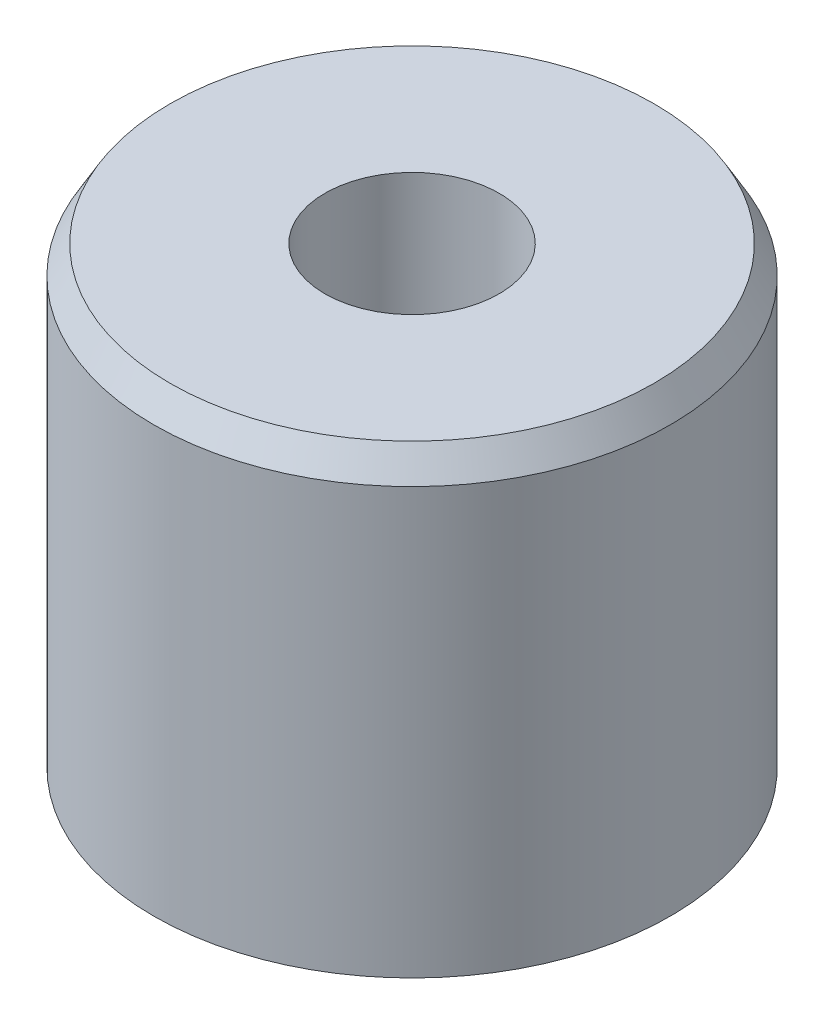
ISO-10303-21;
HEADER;
FILE_DESCRIPTION(('STEP AP214'),'2;1');
FILE_NAME('part.step','',(''),(''),'','','');
FILE_SCHEMA(('AUTOMOTIVE_DESIGN { 1 0 10303 214 1 1 1 1 }'));
ENDSEC;
DATA;
#1=APPLICATION_CONTEXT('core data for automotive mechanical design processes');
#2=APPLICATION_PROTOCOL_DEFINITION('international standard','automotive_design',2000,#1);
#3=PRODUCT_CONTEXT('',#1,'mechanical');
#4=PRODUCT('Part','Part','',(#3));
#5=PRODUCT_RELATED_PRODUCT_CATEGORY('part','',(#4));
#6=PRODUCT_DEFINITION_FORMATION('','',#4);
#7=PRODUCT_DEFINITION_CONTEXT('part definition',#1,'design');
#8=PRODUCT_DEFINITION('design','',#6,#7);
#9=PRODUCT_DEFINITION_SHAPE('','',#8);
#10=(LENGTH_UNIT() NAMED_UNIT(*) SI_UNIT(.MILLI.,.METRE.));
#11=(NAMED_UNIT(*) PLANE_ANGLE_UNIT() SI_UNIT($,.RADIAN.));
#12=(NAMED_UNIT(*) SI_UNIT($,.STERADIAN.) SOLID_ANGLE_UNIT());
#13=UNCERTAINTY_MEASURE_WITH_UNIT(LENGTH_MEASURE(1.E-05),#10,'distance_accuracy_value','');
#14=(GEOMETRIC_REPRESENTATION_CONTEXT(3) GLOBAL_UNCERTAINTY_ASSIGNED_CONTEXT((#13)) GLOBAL_UNIT_ASSIGNED_CONTEXT((#10,
#11,#12)) REPRESENTATION_CONTEXT('',''));
#15=CARTESIAN_POINT('',(0.,0.,0.));
#16=DIRECTION('',(0.,0.,1.));
#17=DIRECTION('',(1.,0.,0.));
#18=AXIS2_PLACEMENT_3D('',#15,#16,#17);
#19=CARTESIAN_POINT('',(0.,14.05,0.));
#20=DIRECTION('',(0.,1.,0.));
#21=DIRECTION('',(0.,0.,1.));
#22=AXIS2_PLACEMENT_3D('',#19,#20,#21);
#23=PLANE('',#22);
#24=CARTESIAN_POINT('',(0.,14.05,0.));
#25=DIRECTION('',(0.,1.,0.));
#26=DIRECTION('',(0.,0.,1.));
#27=AXIS2_PLACEMENT_3D('',#24,#25,#26);
#28=CIRCLE('',#27,7.5);
#29=CARTESIAN_POINT('',(0.,14.05,7.5));
#30=VERTEX_POINT('',#29);
#31=EDGE_CURVE('E45',#30,#30,#28,.T.);
#32=ORIENTED_EDGE('',*,*,#31,.T.);
#33=EDGE_LOOP('',(#32));
#34=FACE_BOUND('',#33,.T.);
#35=CARTESIAN_POINT('',(0.,14.05,0.));
#36=DIRECTION('',(0.,1.,0.));
#37=DIRECTION('',(0.,0.,1.));
#38=AXIS2_PLACEMENT_3D('',#35,#36,#37);
#39=CIRCLE('',#38,2.7);
#40=CARTESIAN_POINT('',(0.,14.05,2.7));
#41=VERTEX_POINT('',#40);
#42=EDGE_CURVE('E65',#41,#41,#39,.T.);
#43=ORIENTED_EDGE('',*,*,#42,.F.);
#44=EDGE_LOOP('',(#43));
#45=FACE_BOUND('',#44,.T.);
#46=ADVANCED_FACE('F37',(#34,#45),#23,.T.);
#47=CARTESIAN_POINT('',(0.,0.,0.));
#48=DIRECTION('',(0.,1.,0.));
#49=DIRECTION('',(0.,0.,1.));
#50=AXIS2_PLACEMENT_3D('',#47,#48,#49);
#51=PLANE('',#50);
#52=CARTESIAN_POINT('',(0.,0.,0.));
#53=DIRECTION('',(0.,1.,0.));
#54=DIRECTION('',(0.,0.,1.));
#55=AXIS2_PLACEMENT_3D('',#52,#53,#54);
#56=CIRCLE('',#55,5.7);
#57=CARTESIAN_POINT('',(0.,0.,5.7));
#58=VERTEX_POINT('',#57);
#59=EDGE_CURVE('E55',#58,#58,#56,.T.);
#60=ORIENTED_EDGE('',*,*,#59,.T.);
#61=EDGE_LOOP('',(#60));
#62=FACE_BOUND('',#61,.T.);
#63=CARTESIAN_POINT('',(0.,0.,0.));
#64=DIRECTION('',(0.,1.,0.));
#65=DIRECTION('',(0.,0.,1.));
#66=AXIS2_PLACEMENT_3D('',#63,#64,#65);
#67=CIRCLE('',#66,8.);
#68=CARTESIAN_POINT('',(0.,0.,8.));
#69=VERTEX_POINT('',#68);
#70=EDGE_CURVE('E61',#69,#69,#67,.T.);
#71=ORIENTED_EDGE('',*,*,#70,.F.);
#72=EDGE_LOOP('',(#71));
#73=FACE_BOUND('',#72,.T.);
#74=ADVANCED_FACE('F73',(#62,#73),#51,.F.);
#75=CARTESIAN_POINT('',(0.,14.05,0.));
#76=DIRECTION('',(0.,-1.,0.));
#77=DIRECTION('',(0.,0.,-1.));
#78=AXIS2_PLACEMENT_3D('',#75,#76,#77);
#79=CYLINDRICAL_SURFACE('',#78,8.);
#80=CARTESIAN_POINT('',(0.,13.1839745962156,0.));
#81=DIRECTION('',(0.,1.,0.));
#82=DIRECTION('',(0.,0.,1.));
#83=AXIS2_PLACEMENT_3D('',#80,#81,#82);
#84=CIRCLE('',#83,8.);
#85=CARTESIAN_POINT('',(0.,13.1839745962156,8.));
#86=VERTEX_POINT('',#85);
#87=EDGE_CURVE('E10',#86,#86,#84,.F.);
#88=ORIENTED_EDGE('',*,*,#87,.T.);
#89=EDGE_LOOP('',(#88));
#90=FACE_BOUND('',#89,.T.);
#91=ORIENTED_EDGE('',*,*,#70,.T.);
#92=EDGE_LOOP('',(#91));
#93=FACE_BOUND('',#92,.T.);
#94=ADVANCED_FACE('F78',(#90,#93),#79,.T.);
#95=CARTESIAN_POINT('',(0.,14.05,0.));
#96=DIRECTION('',(0.,-1.,0.));
#97=DIRECTION('',(0.,0.,-1.));
#98=AXIS2_PLACEMENT_3D('',#95,#96,#97);
#99=CYLINDRICAL_SURFACE('',#98,2.7);
#100=CARTESIAN_POINT('',(0.,8.24243225836384,0.));
#101=DIRECTION('',(0.,1.,0.));
#102=DIRECTION('',(0.,0.,1.));
#103=AXIS2_PLACEMENT_3D('',#100,#101,#102);
#104=CIRCLE('',#103,2.7);
#105=CARTESIAN_POINT('',(0.,8.24243225836384,2.7));
#106=VERTEX_POINT('',#105);
#107=EDGE_CURVE('E50',#106,#106,#104,.F.);
#108=ORIENTED_EDGE('',*,*,#107,.T.);
#109=EDGE_LOOP('',(#108));
#110=FACE_BOUND('',#109,.T.);
#111=ORIENTED_EDGE('',*,*,#42,.T.);
#112=EDGE_LOOP('',(#111));
#113=FACE_BOUND('',#112,.T.);
#114=ADVANCED_FACE('F70',(#110,#113),#99,.F.);
#115=CARTESIAN_POINT('',(0.,0.,0.));
#116=DIRECTION('',(0.,-1.,0.));
#117=DIRECTION('',(0.,0.,-1.));
#118=AXIS2_PLACEMENT_3D('',#115,#116,#117);
#119=CONICAL_SURFACE('',#118,5.7,0.349065850398867);
#120=ORIENTED_EDGE('',*,*,#107,.F.);
#121=EDGE_LOOP('',(#120));
#122=FACE_BOUND('',#121,.T.);
#123=ORIENTED_EDGE('',*,*,#59,.F.);
#124=EDGE_LOOP('',(#123));
#125=FACE_BOUND('',#124,.T.);
#126=ADVANCED_FACE('F84',(#122,#125),#119,.F.);
#127=CARTESIAN_POINT('',(0.,14.05,0.));
#128=DIRECTION('',(0.,-1.,0.));
#129=DIRECTION('',(0.,0.,-1.));
#130=AXIS2_PLACEMENT_3D('',#127,#128,#129);
#131=CONICAL_SURFACE('',#130,7.5,0.523598775598299);
#132=ORIENTED_EDGE('',*,*,#87,.F.);
#133=EDGE_LOOP('',(#132));
#134=FACE_BOUND('',#133,.T.);
#135=ORIENTED_EDGE('',*,*,#31,.F.);
#136=EDGE_LOOP('',(#135));
#137=FACE_BOUND('',#136,.T.);
#138=ADVANCED_FACE('F39',(#134,#137),#131,.T.);
#139=CLOSED_SHELL('',(#46,#74,#94,#114,#126,#138));
#140=MANIFOLD_SOLID_BREP('B2',#139);
#141=ADVANCED_BREP_SHAPE_REPRESENTATION('',(#18,#140),#14);
#142=SHAPE_DEFINITION_REPRESENTATION(#9,#141);
ENDSEC;
END-ISO-10303-21;
